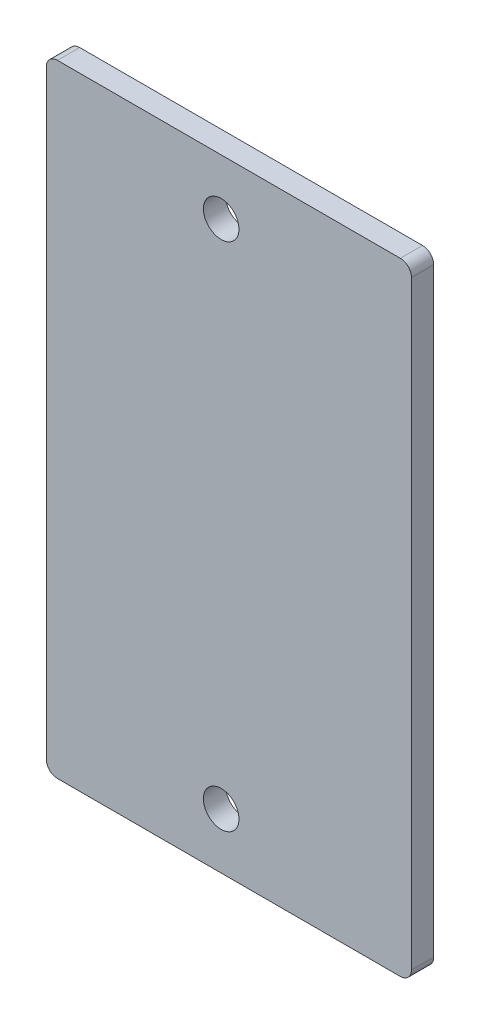
ISO-10303-21;
HEADER;
FILE_DESCRIPTION(('STEP AP214'),'2;1');
FILE_NAME('part.step','',(''),(''),'','','');
FILE_SCHEMA(('AUTOMOTIVE_DESIGN { 1 0 10303 214 1 1 1 1 }'));
ENDSEC;
DATA;
#1=APPLICATION_CONTEXT('core data for automotive mechanical design processes');
#2=APPLICATION_PROTOCOL_DEFINITION('international standard','automotive_design',2000,#1);
#3=PRODUCT_CONTEXT('',#1,'mechanical');
#4=PRODUCT('Part','Part','',(#3));
#5=PRODUCT_RELATED_PRODUCT_CATEGORY('part','',(#4));
#6=PRODUCT_DEFINITION_FORMATION('','',#4);
#7=PRODUCT_DEFINITION_CONTEXT('part definition',#1,'design');
#8=PRODUCT_DEFINITION('design','',#6,#7);
#9=PRODUCT_DEFINITION_SHAPE('','',#8);
#10=(LENGTH_UNIT() NAMED_UNIT(*) SI_UNIT(.MILLI.,.METRE.));
#11=(NAMED_UNIT(*) PLANE_ANGLE_UNIT() SI_UNIT($,.RADIAN.));
#12=(NAMED_UNIT(*) SI_UNIT($,.STERADIAN.) SOLID_ANGLE_UNIT());
#13=UNCERTAINTY_MEASURE_WITH_UNIT(LENGTH_MEASURE(1.E-05),#10,'distance_accuracy_value','');
#14=(GEOMETRIC_REPRESENTATION_CONTEXT(3) GLOBAL_UNCERTAINTY_ASSIGNED_CONTEXT((#13)) GLOBAL_UNIT_ASSIGNED_CONTEXT((#10,
#11,#12)) REPRESENTATION_CONTEXT('',''));
#15=CARTESIAN_POINT('',(0.,0.,0.));
#16=DIRECTION('',(0.,0.,1.));
#17=DIRECTION('',(1.,0.,0.));
#18=AXIS2_PLACEMENT_3D('',#15,#16,#17);
#19=CARTESIAN_POINT('',(-65.2064186691778,-55.,2.));
#20=DIRECTION('',(0.,0.,-1.));
#21=DIRECTION('',(-1.,0.,0.));
#22=AXIS2_PLACEMENT_3D('',#19,#20,#21);
#23=PLANE('',#22);
#24=CARTESIAN_POINT('',(-65.2064186691778,-55.,2.));
#25=DIRECTION('',(0.,0.,1.));
#26=DIRECTION('',(-1.,0.,0.));
#27=AXIS2_PLACEMENT_3D('',#24,#25,#26);
#28=CIRCLE('',#27,1.);
#29=CARTESIAN_POINT('',(-66.2064186691778,-55.,2.));
#30=VERTEX_POINT('',#29);
#31=CARTESIAN_POINT('',(-65.2064186691778,-56.,2.));
#32=VERTEX_POINT('',#31);
#33=EDGE_CURVE('E149',#30,#32,#28,.T.);
#34=ORIENTED_EDGE('',*,*,#33,.T.);
#35=DIRECTION('',(1.,0.,0.));
#36=VECTOR('',#35,1.);
#37=CARTESIAN_POINT('',(-65.2064186691778,-56.,2.));
#38=LINE('',#37,#36);
#39=CARTESIAN_POINT('',(-34.3330586643056,-56.,2.));
#40=VERTEX_POINT('',#39);
#41=EDGE_CURVE('E97',#32,#40,#38,.T.);
#42=ORIENTED_EDGE('',*,*,#41,.T.);
#43=CARTESIAN_POINT('',(-34.3330586643056,-55.,2.));
#44=DIRECTION('',(0.,0.,1.));
#45=DIRECTION('',(1.,0.,0.));
#46=AXIS2_PLACEMENT_3D('',#43,#44,#45);
#47=CIRCLE('',#46,1.);
#48=CARTESIAN_POINT('',(-33.3330586643056,-55.,2.));
#49=VERTEX_POINT('',#48);
#50=EDGE_CURVE('E164',#40,#49,#47,.T.);
#51=ORIENTED_EDGE('',*,*,#50,.T.);
#52=DIRECTION('',(0.,1.,0.));
#53=VECTOR('',#52,1.);
#54=CARTESIAN_POINT('',(-33.3330586643056,-55.,2.));
#55=LINE('',#54,#53);
#56=CARTESIAN_POINT('',(-33.3330586643056,-0.999999999999996,2.));
#57=VERTEX_POINT('',#56);
#58=EDGE_CURVE('E177',#49,#57,#55,.T.);
#59=ORIENTED_EDGE('',*,*,#58,.T.);
#60=CARTESIAN_POINT('',(-34.3330586643056,-0.999999999999996,2.));
#61=DIRECTION('',(0.,0.,1.));
#62=DIRECTION('',(1.,0.,0.));
#63=AXIS2_PLACEMENT_3D('',#60,#61,#62);
#64=CIRCLE('',#63,1.);
#65=CARTESIAN_POINT('',(-34.3330586643056,0.,2.));
#66=VERTEX_POINT('',#65);
#67=EDGE_CURVE('E116',#57,#66,#64,.T.);
#68=ORIENTED_EDGE('',*,*,#67,.T.);
#69=DIRECTION('',(-1.,0.,0.));
#70=VECTOR('',#69,1.);
#71=CARTESIAN_POINT('',(-65.2064186691778,0.,2.));
#72=LINE('',#71,#70);
#73=CARTESIAN_POINT('',(-65.2064186691778,0.,2.));
#74=VERTEX_POINT('',#73);
#75=EDGE_CURVE('E110',#66,#74,#72,.T.);
#76=ORIENTED_EDGE('',*,*,#75,.T.);
#77=CARTESIAN_POINT('',(-65.2064186691778,-0.999999999999996,2.));
#78=DIRECTION('',(0.,0.,1.));
#79=DIRECTION('',(-1.,0.,0.));
#80=AXIS2_PLACEMENT_3D('',#77,#78,#79);
#81=CIRCLE('',#80,1.);
#82=CARTESIAN_POINT('',(-66.2064186691778,-0.999999999999996,2.));
#83=VERTEX_POINT('',#82);
#84=EDGE_CURVE('E114',#74,#83,#81,.T.);
#85=ORIENTED_EDGE('',*,*,#84,.T.);
#86=DIRECTION('',(0.,-1.,0.));
#87=VECTOR('',#86,1.);
#88=CARTESIAN_POINT('',(-66.2064186691778,-55.,2.));
#89=LINE('',#88,#87);
#90=EDGE_CURVE('E54',#83,#30,#89,.T.);
#91=ORIENTED_EDGE('',*,*,#90,.T.);
#92=EDGE_LOOP('',(#34,#42,#51,#59,#68,#76,#85,#91));
#93=FACE_BOUND('',#92,.T.);
#94=CARTESIAN_POINT('',(-50.4651021990482,-5.,2.));
#95=DIRECTION('',(0.,0.,1.));
#96=DIRECTION('',(1.,0.,0.));
#97=AXIS2_PLACEMENT_3D('',#94,#95,#96);
#98=CIRCLE('',#97,1.60000000000001);
#99=CARTESIAN_POINT('',(-48.8651021990482,-5.,2.));
#100=VERTEX_POINT('',#99);
#101=EDGE_CURVE('E138',#100,#100,#98,.T.);
#102=ORIENTED_EDGE('',*,*,#101,.F.);
#103=EDGE_LOOP('',(#102));
#104=FACE_BOUND('',#103,.T.);
#105=CARTESIAN_POINT('',(-50.4651021990482,-51.,2.));
#106=DIRECTION('',(0.,0.,1.));
#107=DIRECTION('',(1.,0.,0.));
#108=AXIS2_PLACEMENT_3D('',#105,#106,#107);
#109=CIRCLE('',#108,1.6);
#110=CARTESIAN_POINT('',(-48.8651021990482,-51.,2.));
#111=VERTEX_POINT('',#110);
#112=EDGE_CURVE('E186',#111,#111,#109,.T.);
#113=ORIENTED_EDGE('',*,*,#112,.F.);
#114=EDGE_LOOP('',(#113));
#115=FACE_BOUND('',#114,.T.);
#116=ADVANCED_FACE('F37',(#93,#104,#115),#23,.F.);
#117=CARTESIAN_POINT('',(-65.2064186691778,-55.,0.));
#118=DIRECTION('',(0.,0.,-1.));
#119=DIRECTION('',(-1.,0.,0.));
#120=AXIS2_PLACEMENT_3D('',#117,#118,#119);
#121=PLANE('',#120);
#122=CARTESIAN_POINT('',(-50.4651021990482,-5.,0.));
#123=DIRECTION('',(0.,0.,1.));
#124=DIRECTION('',(1.,0.,0.));
#125=AXIS2_PLACEMENT_3D('',#122,#123,#124);
#126=CIRCLE('',#125,1.60000000000001);
#127=CARTESIAN_POINT('',(-48.8651021990482,-5.,0.));
#128=VERTEX_POINT('',#127);
#129=EDGE_CURVE('E183',#128,#128,#126,.T.);
#130=ORIENTED_EDGE('',*,*,#129,.T.);
#131=EDGE_LOOP('',(#130));
#132=FACE_BOUND('',#131,.T.);
#133=CARTESIAN_POINT('',(-65.2064186691778,-55.,0.));
#134=DIRECTION('',(0.,0.,1.));
#135=DIRECTION('',(-1.,0.,0.));
#136=AXIS2_PLACEMENT_3D('',#133,#134,#135);
#137=CIRCLE('',#136,1.);
#138=CARTESIAN_POINT('',(-66.2064186691778,-55.,0.));
#139=VERTEX_POINT('',#138);
#140=CARTESIAN_POINT('',(-65.2064186691778,-56.,0.));
#141=VERTEX_POINT('',#140);
#142=EDGE_CURVE('E134',#139,#141,#137,.T.);
#143=ORIENTED_EDGE('',*,*,#142,.F.);
#144=DIRECTION('',(0.,-1.,0.));
#145=VECTOR('',#144,1.);
#146=CARTESIAN_POINT('',(-66.2064186691778,-55.,0.));
#147=LINE('',#146,#145);
#148=CARTESIAN_POINT('',(-66.2064186691778,-0.999999999999996,0.));
#149=VERTEX_POINT('',#148);
#150=EDGE_CURVE('E89',#149,#139,#147,.T.);
#151=ORIENTED_EDGE('',*,*,#150,.F.);
#152=CARTESIAN_POINT('',(-65.2064186691778,-0.999999999999996,0.));
#153=DIRECTION('',(0.,0.,1.));
#154=DIRECTION('',(-1.,0.,0.));
#155=AXIS2_PLACEMENT_3D('',#152,#153,#154);
#156=CIRCLE('',#155,1.);
#157=CARTESIAN_POINT('',(-65.2064186691778,0.,0.));
#158=VERTEX_POINT('',#157);
#159=EDGE_CURVE('E83',#158,#149,#156,.T.);
#160=ORIENTED_EDGE('',*,*,#159,.F.);
#161=DIRECTION('',(-1.,0.,0.));
#162=VECTOR('',#161,1.);
#163=CARTESIAN_POINT('',(-65.2064186691778,0.,0.));
#164=LINE('',#163,#162);
#165=CARTESIAN_POINT('',(-34.3330586643056,0.,0.));
#166=VERTEX_POINT('',#165);
#167=EDGE_CURVE('E124',#166,#158,#164,.T.);
#168=ORIENTED_EDGE('',*,*,#167,.F.);
#169=CARTESIAN_POINT('',(-34.3330586643056,-0.999999999999996,0.));
#170=DIRECTION('',(0.,0.,1.));
#171=DIRECTION('',(1.,0.,0.));
#172=AXIS2_PLACEMENT_3D('',#169,#170,#171);
#173=CIRCLE('',#172,1.);
#174=CARTESIAN_POINT('',(-33.3330586643056,-0.999999999999996,0.));
#175=VERTEX_POINT('',#174);
#176=EDGE_CURVE('E144',#175,#166,#173,.T.);
#177=ORIENTED_EDGE('',*,*,#176,.F.);
#178=DIRECTION('',(0.,1.,0.));
#179=VECTOR('',#178,1.);
#180=CARTESIAN_POINT('',(-33.3330586643056,-55.,0.));
#181=LINE('',#180,#179);
#182=CARTESIAN_POINT('',(-33.3330586643056,-55.,0.));
#183=VERTEX_POINT('',#182);
#184=EDGE_CURVE('E142',#183,#175,#181,.T.);
#185=ORIENTED_EDGE('',*,*,#184,.F.);
#186=CARTESIAN_POINT('',(-34.3330586643056,-55.,0.));
#187=DIRECTION('',(0.,0.,1.));
#188=DIRECTION('',(1.,0.,0.));
#189=AXIS2_PLACEMENT_3D('',#186,#187,#188);
#190=CIRCLE('',#189,1.);
#191=CARTESIAN_POINT('',(-34.3330586643056,-56.,0.));
#192=VERTEX_POINT('',#191);
#193=EDGE_CURVE('E140',#192,#183,#190,.T.);
#194=ORIENTED_EDGE('',*,*,#193,.F.);
#195=DIRECTION('',(1.,0.,0.));
#196=VECTOR('',#195,1.);
#197=CARTESIAN_POINT('',(-65.2064186691778,-56.,0.));
#198=LINE('',#197,#196);
#199=EDGE_CURVE('E137',#141,#192,#198,.T.);
#200=ORIENTED_EDGE('',*,*,#199,.F.);
#201=EDGE_LOOP('',(#143,#151,#160,#168,#177,#185,#194,#200));
#202=FACE_BOUND('',#201,.T.);
#203=CARTESIAN_POINT('',(-50.4651021990482,-51.,0.));
#204=DIRECTION('',(0.,0.,1.));
#205=DIRECTION('',(1.,0.,0.));
#206=AXIS2_PLACEMENT_3D('',#203,#204,#205);
#207=CIRCLE('',#206,1.6);
#208=CARTESIAN_POINT('',(-48.8651021990482,-51.,0.));
#209=VERTEX_POINT('',#208);
#210=EDGE_CURVE('E189',#209,#209,#207,.T.);
#211=ORIENTED_EDGE('',*,*,#210,.T.);
#212=EDGE_LOOP('',(#211));
#213=FACE_BOUND('',#212,.T.);
#214=ADVANCED_FACE('F168',(#132,#202,#213),#121,.T.);
#215=CARTESIAN_POINT('',(-65.2064186691778,-55.,2.));
#216=DIRECTION('',(0.,0.,-1.));
#217=DIRECTION('',(-1.,0.,0.));
#218=AXIS2_PLACEMENT_3D('',#215,#216,#217);
#219=CYLINDRICAL_SURFACE('',#218,1.);
#220=ORIENTED_EDGE('',*,*,#142,.T.);
#221=DIRECTION('',(0.,0.,-1.));
#222=VECTOR('',#221,1.);
#223=CARTESIAN_POINT('',(-65.2064186691778,-56.,2.));
#224=LINE('',#223,#222);
#225=EDGE_CURVE('E11',#32,#141,#224,.T.);
#226=ORIENTED_EDGE('',*,*,#225,.F.);
#227=ORIENTED_EDGE('',*,*,#33,.F.);
#228=DIRECTION('',(0.,0.,-1.));
#229=VECTOR('',#228,1.);
#230=CARTESIAN_POINT('',(-66.2064186691778,-55.,2.));
#231=LINE('',#230,#229);
#232=EDGE_CURVE('E130',#30,#139,#231,.T.);
#233=ORIENTED_EDGE('',*,*,#232,.T.);
#234=EDGE_LOOP('',(#220,#226,#227,#233));
#235=FACE_BOUND('',#234,.T.);
#236=ADVANCED_FACE('F39',(#235),#219,.T.);
#237=CARTESIAN_POINT('',(-65.2064186691778,-56.,2.));
#238=DIRECTION('',(0.,1.,0.));
#239=DIRECTION('',(0.,0.,1.));
#240=AXIS2_PLACEMENT_3D('',#237,#238,#239);
#241=PLANE('',#240);
#242=ORIENTED_EDGE('',*,*,#199,.T.);
#243=DIRECTION('',(0.,0.,-1.));
#244=VECTOR('',#243,1.);
#245=CARTESIAN_POINT('',(-34.3330586643056,-56.,2.));
#246=LINE('',#245,#244);
#247=EDGE_CURVE('E46',#40,#192,#246,.T.);
#248=ORIENTED_EDGE('',*,*,#247,.F.);
#249=ORIENTED_EDGE('',*,*,#41,.F.);
#250=ORIENTED_EDGE('',*,*,#225,.T.);
#251=EDGE_LOOP('',(#242,#248,#249,#250));
#252=FACE_BOUND('',#251,.T.);
#253=ADVANCED_FACE('F221',(#252),#241,.F.);
#254=CARTESIAN_POINT('',(-34.3330586643056,-55.,2.));
#255=DIRECTION('',(0.,0.,-1.));
#256=DIRECTION('',(-1.,0.,0.));
#257=AXIS2_PLACEMENT_3D('',#254,#255,#256);
#258=CYLINDRICAL_SURFACE('',#257,1.);
#259=ORIENTED_EDGE('',*,*,#193,.T.);
#260=DIRECTION('',(0.,0.,-1.));
#261=VECTOR('',#260,1.);
#262=CARTESIAN_POINT('',(-33.3330586643056,-55.,2.));
#263=LINE('',#262,#261);
#264=EDGE_CURVE('E156',#49,#183,#263,.T.);
#265=ORIENTED_EDGE('',*,*,#264,.F.);
#266=ORIENTED_EDGE('',*,*,#50,.F.);
#267=ORIENTED_EDGE('',*,*,#247,.T.);
#268=EDGE_LOOP('',(#259,#265,#266,#267));
#269=FACE_BOUND('',#268,.T.);
#270=ADVANCED_FACE('F162',(#269),#258,.T.);
#271=CARTESIAN_POINT('',(-33.3330586643056,-55.,2.));
#272=DIRECTION('',(-1.,0.,0.));
#273=DIRECTION('',(0.,0.,1.));
#274=AXIS2_PLACEMENT_3D('',#271,#272,#273);
#275=PLANE('',#274);
#276=ORIENTED_EDGE('',*,*,#184,.T.);
#277=DIRECTION('',(0.,0.,-1.));
#278=VECTOR('',#277,1.);
#279=CARTESIAN_POINT('',(-33.3330586643056,-0.999999999999996,2.));
#280=LINE('',#279,#278);
#281=EDGE_CURVE('E153',#57,#175,#280,.T.);
#282=ORIENTED_EDGE('',*,*,#281,.F.);
#283=ORIENTED_EDGE('',*,*,#58,.F.);
#284=ORIENTED_EDGE('',*,*,#264,.T.);
#285=EDGE_LOOP('',(#276,#282,#283,#284));
#286=FACE_BOUND('',#285,.T.);
#287=ADVANCED_FACE('F173',(#286),#275,.F.);
#288=CARTESIAN_POINT('',(-34.3330586643056,-0.999999999999996,2.));
#289=DIRECTION('',(0.,0.,-1.));
#290=DIRECTION('',(-1.,0.,0.));
#291=AXIS2_PLACEMENT_3D('',#288,#289,#290);
#292=CYLINDRICAL_SURFACE('',#291,1.);
#293=ORIENTED_EDGE('',*,*,#176,.T.);
#294=DIRECTION('',(0.,0.,-1.));
#295=VECTOR('',#294,1.);
#296=CARTESIAN_POINT('',(-34.3330586643056,0.,2.));
#297=LINE('',#296,#295);
#298=EDGE_CURVE('E125',#66,#166,#297,.T.);
#299=ORIENTED_EDGE('',*,*,#298,.F.);
#300=ORIENTED_EDGE('',*,*,#67,.F.);
#301=ORIENTED_EDGE('',*,*,#281,.T.);
#302=EDGE_LOOP('',(#293,#299,#300,#301));
#303=FACE_BOUND('',#302,.T.);
#304=ADVANCED_FACE('F176',(#303),#292,.T.);
#305=CARTESIAN_POINT('',(-65.2064186691778,0.,2.));
#306=DIRECTION('',(0.,-1.,0.));
#307=DIRECTION('',(0.,0.,-1.));
#308=AXIS2_PLACEMENT_3D('',#305,#306,#307);
#309=PLANE('',#308);
#310=ORIENTED_EDGE('',*,*,#167,.T.);
#311=DIRECTION('',(0.,0.,-1.));
#312=VECTOR('',#311,1.);
#313=CARTESIAN_POINT('',(-65.2064186691778,0.,2.));
#314=LINE('',#313,#312);
#315=EDGE_CURVE('E121',#74,#158,#314,.T.);
#316=ORIENTED_EDGE('',*,*,#315,.F.);
#317=ORIENTED_EDGE('',*,*,#75,.F.);
#318=ORIENTED_EDGE('',*,*,#298,.T.);
#319=EDGE_LOOP('',(#310,#316,#317,#318));
#320=FACE_BOUND('',#319,.T.);
#321=ADVANCED_FACE('F122',(#320),#309,.F.);
#322=CARTESIAN_POINT('',(-65.2064186691778,-0.999999999999996,2.));
#323=DIRECTION('',(0.,0.,-1.));
#324=DIRECTION('',(-1.,0.,0.));
#325=AXIS2_PLACEMENT_3D('',#322,#323,#324);
#326=CYLINDRICAL_SURFACE('',#325,1.);
#327=ORIENTED_EDGE('',*,*,#159,.T.);
#328=DIRECTION('',(0.,0.,-1.));
#329=VECTOR('',#328,1.);
#330=CARTESIAN_POINT('',(-66.2064186691778,-0.999999999999996,2.));
#331=LINE('',#330,#329);
#332=EDGE_CURVE('E126',#83,#149,#331,.T.);
#333=ORIENTED_EDGE('',*,*,#332,.F.);
#334=ORIENTED_EDGE('',*,*,#84,.F.);
#335=ORIENTED_EDGE('',*,*,#315,.T.);
#336=EDGE_LOOP('',(#327,#333,#334,#335));
#337=FACE_BOUND('',#336,.T.);
#338=ADVANCED_FACE('F128',(#337),#326,.T.);
#339=CARTESIAN_POINT('',(-66.2064186691778,-55.,2.));
#340=DIRECTION('',(1.,0.,0.));
#341=DIRECTION('',(0.,0.,-1.));
#342=AXIS2_PLACEMENT_3D('',#339,#340,#341);
#343=PLANE('',#342);
#344=ORIENTED_EDGE('',*,*,#150,.T.);
#345=ORIENTED_EDGE('',*,*,#232,.F.);
#346=ORIENTED_EDGE('',*,*,#90,.F.);
#347=ORIENTED_EDGE('',*,*,#332,.T.);
#348=EDGE_LOOP('',(#344,#345,#346,#347));
#349=FACE_BOUND('',#348,.T.);
#350=ADVANCED_FACE('F209',(#349),#343,.F.);
#351=CARTESIAN_POINT('',(-50.4651021990482,-5.,2.));
#352=DIRECTION('',(0.,0.,-1.));
#353=DIRECTION('',(-1.,0.,0.));
#354=AXIS2_PLACEMENT_3D('',#351,#352,#353);
#355=CYLINDRICAL_SURFACE('',#354,1.60000000000001);
#356=ORIENTED_EDGE('',*,*,#101,.T.);
#357=EDGE_LOOP('',(#356));
#358=FACE_BOUND('',#357,.T.);
#359=ORIENTED_EDGE('',*,*,#129,.F.);
#360=EDGE_LOOP('',(#359));
#361=FACE_BOUND('',#360,.T.);
#362=ADVANCED_FACE('F206',(#358,#361),#355,.F.);
#363=CARTESIAN_POINT('',(-50.4651021990482,-51.,2.));
#364=DIRECTION('',(0.,0.,-1.));
#365=DIRECTION('',(-1.,0.,0.));
#366=AXIS2_PLACEMENT_3D('',#363,#364,#365);
#367=CYLINDRICAL_SURFACE('',#366,1.6);
#368=ORIENTED_EDGE('',*,*,#112,.T.);
#369=EDGE_LOOP('',(#368));
#370=FACE_BOUND('',#369,.T.);
#371=ORIENTED_EDGE('',*,*,#210,.F.);
#372=EDGE_LOOP('',(#371));
#373=FACE_BOUND('',#372,.T.);
#374=ADVANCED_FACE('F195',(#370,#373),#367,.F.);
#375=CLOSED_SHELL('',(#116,#214,#236,#253,#270,#287,#304,#321,#338,#350,#362,#374));
#376=MANIFOLD_SOLID_BREP('B2',#375);
#377=ADVANCED_BREP_SHAPE_REPRESENTATION('',(#18,#376),#14);
#378=SHAPE_DEFINITION_REPRESENTATION(#9,#377);
ENDSEC;
END-ISO-10303-21;
